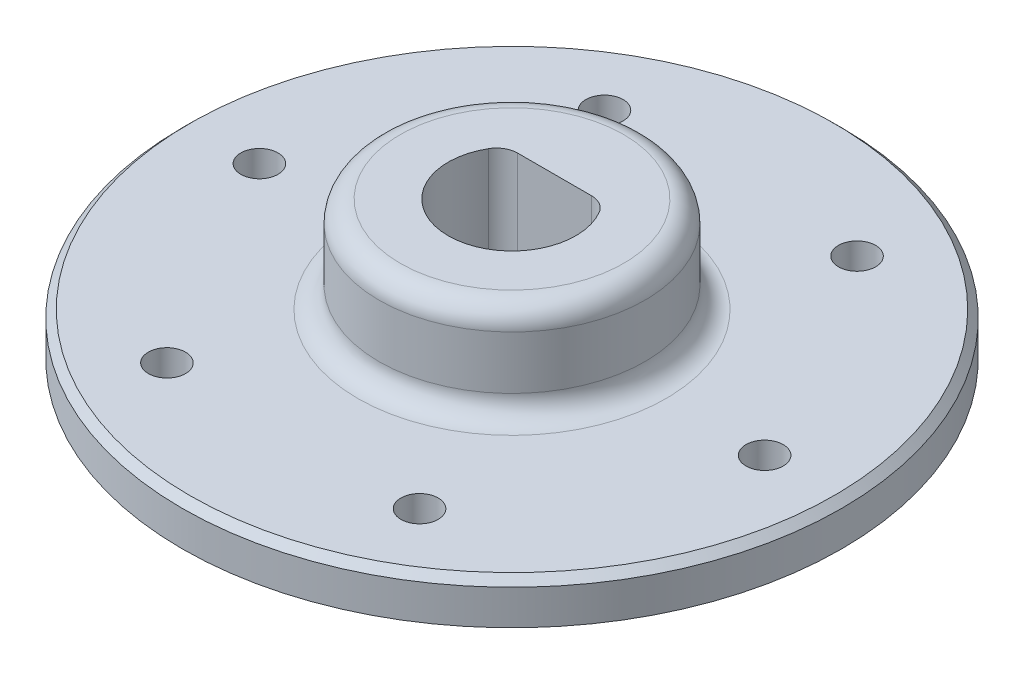
ISO-10303-21;
HEADER;
FILE_DESCRIPTION(('STEP AP214'),'2;1');
FILE_NAME('part.step','',(''),(''),'','','');
FILE_SCHEMA(('AUTOMOTIVE_DESIGN { 1 0 10303 214 1 1 1 1 }'));
ENDSEC;
DATA;
#1=APPLICATION_CONTEXT('core data for automotive mechanical design processes');
#2=APPLICATION_PROTOCOL_DEFINITION('international standard','automotive_design',2000,#1);
#3=PRODUCT_CONTEXT('',#1,'mechanical');
#4=PRODUCT('Part','Part','',(#3));
#5=PRODUCT_RELATED_PRODUCT_CATEGORY('part','',(#4));
#6=PRODUCT_DEFINITION_FORMATION('','',#4);
#7=PRODUCT_DEFINITION_CONTEXT('part definition',#1,'design');
#8=PRODUCT_DEFINITION('design','',#6,#7);
#9=PRODUCT_DEFINITION_SHAPE('','',#8);
#10=(LENGTH_UNIT() NAMED_UNIT(*) SI_UNIT(.MILLI.,.METRE.));
#11=(NAMED_UNIT(*) PLANE_ANGLE_UNIT() SI_UNIT($,.RADIAN.));
#12=(NAMED_UNIT(*) SI_UNIT($,.STERADIAN.) SOLID_ANGLE_UNIT());
#13=UNCERTAINTY_MEASURE_WITH_UNIT(LENGTH_MEASURE(1.E-05),#10,'distance_accuracy_value','');
#14=(GEOMETRIC_REPRESENTATION_CONTEXT(3) GLOBAL_UNCERTAINTY_ASSIGNED_CONTEXT((#13)) GLOBAL_UNIT_ASSIGNED_CONTEXT((#10,
#11,#12)) REPRESENTATION_CONTEXT('',''));
#15=CARTESIAN_POINT('',(0.,0.,0.));
#16=DIRECTION('',(0.,0.,1.));
#17=DIRECTION('',(1.,0.,0.));
#18=AXIS2_PLACEMENT_3D('',#15,#16,#17);
#19=CARTESIAN_POINT('',(0.,4.,0.));
#20=DIRECTION('',(0.,1.,0.));
#21=DIRECTION('',(0.,0.,1.));
#22=AXIS2_PLACEMENT_3D('',#19,#20,#21);
#23=PLANE('',#22);
#24=CARTESIAN_POINT('',(0.,4.,0.));
#25=DIRECTION('',(0.,1.,0.));
#26=DIRECTION('',(0.,0.,1.));
#27=AXIS2_PLACEMENT_3D('',#24,#25,#26);
#28=CIRCLE('',#27,30.3);
#29=CARTESIAN_POINT('',(0.,4.,30.3));
#30=VERTEX_POINT('',#29);
#31=EDGE_CURVE('E153',#30,#30,#28,.T.);
#32=ORIENTED_EDGE('',*,*,#31,.T.);
#33=EDGE_LOOP('',(#32));
#34=FACE_BOUND('',#33,.T.);
#35=CARTESIAN_POINT('',(0.,4.,0.));
#36=DIRECTION('',(0.,1.,0.));
#37=DIRECTION('',(0.,0.,1.));
#38=AXIS2_PLACEMENT_3D('',#35,#36,#37);
#39=CIRCLE('',#38,14.5);
#40=CARTESIAN_POINT('',(0.,4.,14.5));
#41=VERTEX_POINT('',#40);
#42=EDGE_CURVE('E147',#41,#41,#39,.F.);
#43=ORIENTED_EDGE('',*,*,#42,.T.);
#44=EDGE_LOOP('',(#43));
#45=FACE_BOUND('',#44,.T.);
#46=CARTESIAN_POINT('',(-11.8749999999977,4.,20.5681033398798));
#47=DIRECTION('',(0.,1.,0.));
#48=DIRECTION('',(0.,0.,1.));
#49=AXIS2_PLACEMENT_3D('',#46,#47,#48);
#50=CIRCLE('',#49,1.75);
#51=CARTESIAN_POINT('',(-11.8749999999977,4.,22.3181033398798));
#52=VERTEX_POINT('',#51);
#53=EDGE_CURVE('E109',#52,#52,#50,.T.);
#54=ORIENTED_EDGE('',*,*,#53,.F.);
#55=EDGE_LOOP('',(#54));
#56=FACE_BOUND('',#55,.T.);
#57=CARTESIAN_POINT('',(23.7500000000006,4.,-2.28723290307542E-12));
#58=DIRECTION('',(0.,1.,0.));
#59=DIRECTION('',(0.,0.,1.));
#60=AXIS2_PLACEMENT_3D('',#57,#58,#59);
#61=CIRCLE('',#60,1.75);
#62=CARTESIAN_POINT('',(23.7500000000006,4.,1.74999999999771));
#63=VERTEX_POINT('',#62);
#64=EDGE_CURVE('E121',#63,#63,#61,.T.);
#65=ORIENTED_EDGE('',*,*,#64,.F.);
#66=EDGE_LOOP('',(#65));
#67=FACE_BOUND('',#66,.T.);
#68=CARTESIAN_POINT('',(-11.875,4.,-20.5681033398804));
#69=DIRECTION('',(0.,1.,0.));
#70=DIRECTION('',(0.,0.,1.));
#71=AXIS2_PLACEMENT_3D('',#68,#69,#70);
#72=CIRCLE('',#71,1.75);
#73=CARTESIAN_POINT('',(-11.875,4.,-18.8181033398804));
#74=VERTEX_POINT('',#73);
#75=EDGE_CURVE('E133',#74,#74,#72,.T.);
#76=ORIENTED_EDGE('',*,*,#75,.F.);
#77=EDGE_LOOP('',(#76));
#78=FACE_BOUND('',#77,.T.);
#79=CARTESIAN_POINT('',(11.8749999999996,4.,-20.5681033398817));
#80=DIRECTION('',(0.,1.,0.));
#81=DIRECTION('',(0.,0.,1.));
#82=AXIS2_PLACEMENT_3D('',#79,#80,#81);
#83=CIRCLE('',#82,1.75);
#84=CARTESIAN_POINT('',(11.8749999999996,4.,-18.8181033398817));
#85=VERTEX_POINT('',#84);
#86=EDGE_CURVE('E127',#85,#85,#83,.T.);
#87=ORIENTED_EDGE('',*,*,#86,.F.);
#88=EDGE_LOOP('',(#87));
#89=FACE_BOUND('',#88,.T.);
#90=CARTESIAN_POINT('',(11.8750000000019,4.,20.5681033398785));
#91=DIRECTION('',(0.,1.,0.));
#92=DIRECTION('',(0.,0.,1.));
#93=AXIS2_PLACEMENT_3D('',#90,#91,#92);
#94=CIRCLE('',#93,1.75);
#95=CARTESIAN_POINT('',(11.8750000000019,4.,22.3181033398785));
#96=VERTEX_POINT('',#95);
#97=EDGE_CURVE('E115',#96,#96,#94,.T.);
#98=ORIENTED_EDGE('',*,*,#97,.F.);
#99=EDGE_LOOP('',(#98));
#100=FACE_BOUND('',#99,.T.);
#101=CARTESIAN_POINT('',(-23.7499999999987,4.,4.01588484688631E-13));
#102=DIRECTION('',(0.,1.,0.));
#103=DIRECTION('',(0.,0.,1.));
#104=AXIS2_PLACEMENT_3D('',#101,#102,#103);
#105=CIRCLE('',#104,1.75);
#106=CARTESIAN_POINT('',(-23.7499999999987,4.,1.7500000000004));
#107=VERTEX_POINT('',#106);
#108=EDGE_CURVE('E102',#107,#107,#105,.T.);
#109=ORIENTED_EDGE('',*,*,#108,.F.);
#110=EDGE_LOOP('',(#109));
#111=FACE_BOUND('',#110,.T.);
#112=ADVANCED_FACE('F33',(#34,#45,#56,#67,#78,#89,#100,#111),#23,.T.);
#113=CARTESIAN_POINT('',(0.,0.,0.));
#114=DIRECTION('',(0.,1.,0.));
#115=DIRECTION('',(0.,0.,1.));
#116=AXIS2_PLACEMENT_3D('',#113,#114,#115);
#117=PLANE('',#116);
#118=CARTESIAN_POINT('',(0.,0.,0.));
#119=DIRECTION('',(0.,1.,0.));
#120=DIRECTION('',(0.,0.,1.));
#121=AXIS2_PLACEMENT_3D('',#118,#119,#120);
#122=CIRCLE('',#121,11.5);
#123=CARTESIAN_POINT('',(0.,0.,11.5));
#124=VERTEX_POINT('',#123);
#125=EDGE_CURVE('E159',#124,#124,#122,.F.);
#126=ORIENTED_EDGE('',*,*,#125,.F.);
#127=EDGE_LOOP('',(#126));
#128=FACE_BOUND('',#127,.T.);
#129=CARTESIAN_POINT('',(0.,0.,0.));
#130=DIRECTION('',(0.,1.,0.));
#131=DIRECTION('',(0.,0.,1.));
#132=AXIS2_PLACEMENT_3D('',#129,#130,#131);
#133=CIRCLE('',#132,31.);
#134=CARTESIAN_POINT('',(0.,0.,31.));
#135=VERTEX_POINT('',#134);
#136=EDGE_CURVE('E136',#135,#135,#133,.T.);
#137=ORIENTED_EDGE('',*,*,#136,.F.);
#138=EDGE_LOOP('',(#137));
#139=FACE_BOUND('',#138,.T.);
#140=CARTESIAN_POINT('',(-11.875,0.,-20.5681033398804));
#141=DIRECTION('',(0.,1.,0.));
#142=DIRECTION('',(0.,0.,1.));
#143=AXIS2_PLACEMENT_3D('',#140,#141,#142);
#144=CIRCLE('',#143,1.75);
#145=CARTESIAN_POINT('',(-11.875,0.,-18.8181033398804));
#146=VERTEX_POINT('',#145);
#147=EDGE_CURVE('E130',#146,#146,#144,.T.);
#148=ORIENTED_EDGE('',*,*,#147,.T.);
#149=EDGE_LOOP('',(#148));
#150=FACE_BOUND('',#149,.T.);
#151=CARTESIAN_POINT('',(11.8749999999996,0.,-20.5681033398817));
#152=DIRECTION('',(0.,1.,0.));
#153=DIRECTION('',(0.,0.,1.));
#154=AXIS2_PLACEMENT_3D('',#151,#152,#153);
#155=CIRCLE('',#154,1.75);
#156=CARTESIAN_POINT('',(11.8749999999996,0.,-18.8181033398817));
#157=VERTEX_POINT('',#156);
#158=EDGE_CURVE('E124',#157,#157,#155,.T.);
#159=ORIENTED_EDGE('',*,*,#158,.T.);
#160=EDGE_LOOP('',(#159));
#161=FACE_BOUND('',#160,.T.);
#162=CARTESIAN_POINT('',(23.7500000000006,0.,-2.28723290307542E-12));
#163=DIRECTION('',(0.,1.,0.));
#164=DIRECTION('',(0.,0.,1.));
#165=AXIS2_PLACEMENT_3D('',#162,#163,#164);
#166=CIRCLE('',#165,1.75);
#167=CARTESIAN_POINT('',(23.7500000000006,0.,1.74999999999771));
#168=VERTEX_POINT('',#167);
#169=EDGE_CURVE('E118',#168,#168,#166,.T.);
#170=ORIENTED_EDGE('',*,*,#169,.T.);
#171=EDGE_LOOP('',(#170));
#172=FACE_BOUND('',#171,.T.);
#173=CARTESIAN_POINT('',(11.8750000000019,0.,20.5681033398785));
#174=DIRECTION('',(0.,1.,0.));
#175=DIRECTION('',(0.,0.,1.));
#176=AXIS2_PLACEMENT_3D('',#173,#174,#175);
#177=CIRCLE('',#176,1.75);
#178=CARTESIAN_POINT('',(11.8750000000019,0.,22.3181033398785));
#179=VERTEX_POINT('',#178);
#180=EDGE_CURVE('E112',#179,#179,#177,.T.);
#181=ORIENTED_EDGE('',*,*,#180,.T.);
#182=EDGE_LOOP('',(#181));
#183=FACE_BOUND('',#182,.T.);
#184=CARTESIAN_POINT('',(-11.8749999999977,0.,20.5681033398798));
#185=DIRECTION('',(0.,1.,0.));
#186=DIRECTION('',(0.,0.,1.));
#187=AXIS2_PLACEMENT_3D('',#184,#185,#186);
#188=CIRCLE('',#187,1.75);
#189=CARTESIAN_POINT('',(-11.8749999999977,0.,22.3181033398798));
#190=VERTEX_POINT('',#189);
#191=EDGE_CURVE('E105',#190,#190,#188,.T.);
#192=ORIENTED_EDGE('',*,*,#191,.T.);
#193=EDGE_LOOP('',(#192));
#194=FACE_BOUND('',#193,.T.);
#195=CARTESIAN_POINT('',(-23.7499999999987,0.,4.01588484688631E-13));
#196=DIRECTION('',(0.,1.,0.));
#197=DIRECTION('',(0.,0.,1.));
#198=AXIS2_PLACEMENT_3D('',#195,#196,#197);
#199=CIRCLE('',#198,1.75);
#200=CARTESIAN_POINT('',(-23.7499999999987,0.,1.7500000000004));
#201=VERTEX_POINT('',#200);
#202=EDGE_CURVE('E106',#201,#201,#199,.T.);
#203=ORIENTED_EDGE('',*,*,#202,.T.);
#204=EDGE_LOOP('',(#203));
#205=FACE_BOUND('',#204,.T.);
#206=ADVANCED_FACE('F182',(#128,#139,#150,#161,#172,#183,#194,#205),#117,.F.);
#207=CARTESIAN_POINT('',(0.,4.,0.));
#208=DIRECTION('',(0.,-1.,0.));
#209=DIRECTION('',(0.,0.,-1.));
#210=AXIS2_PLACEMENT_3D('',#207,#208,#209);
#211=CYLINDRICAL_SURFACE('',#210,31.);
#212=CARTESIAN_POINT('',(0.,3.29999999999998,0.));
#213=DIRECTION('',(0.,1.,0.));
#214=DIRECTION('',(0.,0.,1.));
#215=AXIS2_PLACEMENT_3D('',#212,#213,#214);
#216=CIRCLE('',#215,31.);
#217=CARTESIAN_POINT('',(0.,3.29999999999998,31.));
#218=VERTEX_POINT('',#217);
#219=EDGE_CURVE('E156',#218,#218,#216,.F.);
#220=ORIENTED_EDGE('',*,*,#219,.T.);
#221=EDGE_LOOP('',(#220));
#222=FACE_BOUND('',#221,.T.);
#223=ORIENTED_EDGE('',*,*,#136,.T.);
#224=EDGE_LOOP('',(#223));
#225=FACE_BOUND('',#224,.T.);
#226=ADVANCED_FACE('F188',(#222,#225),#211,.T.);
#227=CARTESIAN_POINT('',(-11.875,4.,-20.5681033398804));
#228=DIRECTION('',(0.,-1.,0.));
#229=DIRECTION('',(0.,0.,-1.));
#230=AXIS2_PLACEMENT_3D('',#227,#228,#229);
#231=CYLINDRICAL_SURFACE('',#230,1.75);
#232=ORIENTED_EDGE('',*,*,#75,.T.);
#233=EDGE_LOOP('',(#232));
#234=FACE_BOUND('',#233,.T.);
#235=ORIENTED_EDGE('',*,*,#147,.F.);
#236=EDGE_LOOP('',(#235));
#237=FACE_BOUND('',#236,.T.);
#238=ADVANCED_FACE('F193',(#234,#237),#231,.F.);
#239=CARTESIAN_POINT('',(11.8749999999996,4.,-20.5681033398817));
#240=DIRECTION('',(0.,-1.,0.));
#241=DIRECTION('',(0.,0.,-1.));
#242=AXIS2_PLACEMENT_3D('',#239,#240,#241);
#243=CYLINDRICAL_SURFACE('',#242,1.75);
#244=ORIENTED_EDGE('',*,*,#86,.T.);
#245=EDGE_LOOP('',(#244));
#246=FACE_BOUND('',#245,.T.);
#247=ORIENTED_EDGE('',*,*,#158,.F.);
#248=EDGE_LOOP('',(#247));
#249=FACE_BOUND('',#248,.T.);
#250=ADVANCED_FACE('F266',(#246,#249),#243,.F.);
#251=CARTESIAN_POINT('',(23.7500000000006,4.,-2.28723290307542E-12));
#252=DIRECTION('',(0.,-1.,0.));
#253=DIRECTION('',(0.,0.,-1.));
#254=AXIS2_PLACEMENT_3D('',#251,#252,#253);
#255=CYLINDRICAL_SURFACE('',#254,1.75);
#256=ORIENTED_EDGE('',*,*,#64,.T.);
#257=EDGE_LOOP('',(#256));
#258=FACE_BOUND('',#257,.T.);
#259=ORIENTED_EDGE('',*,*,#169,.F.);
#260=EDGE_LOOP('',(#259));
#261=FACE_BOUND('',#260,.T.);
#262=ADVANCED_FACE('F263',(#258,#261),#255,.F.);
#263=CARTESIAN_POINT('',(11.8750000000019,4.,20.5681033398785));
#264=DIRECTION('',(0.,-1.,0.));
#265=DIRECTION('',(0.,0.,-1.));
#266=AXIS2_PLACEMENT_3D('',#263,#264,#265);
#267=CYLINDRICAL_SURFACE('',#266,1.75);
#268=ORIENTED_EDGE('',*,*,#97,.T.);
#269=EDGE_LOOP('',(#268));
#270=FACE_BOUND('',#269,.T.);
#271=ORIENTED_EDGE('',*,*,#180,.F.);
#272=EDGE_LOOP('',(#271));
#273=FACE_BOUND('',#272,.T.);
#274=ADVANCED_FACE('F256',(#270,#273),#267,.F.);
#275=CARTESIAN_POINT('',(-11.8749999999977,4.,20.5681033398798));
#276=DIRECTION('',(0.,-1.,0.));
#277=DIRECTION('',(0.,0.,-1.));
#278=AXIS2_PLACEMENT_3D('',#275,#276,#277);
#279=CYLINDRICAL_SURFACE('',#278,1.75);
#280=ORIENTED_EDGE('',*,*,#53,.T.);
#281=EDGE_LOOP('',(#280));
#282=FACE_BOUND('',#281,.T.);
#283=ORIENTED_EDGE('',*,*,#191,.F.);
#284=EDGE_LOOP('',(#283));
#285=FACE_BOUND('',#284,.T.);
#286=ADVANCED_FACE('F247',(#282,#285),#279,.F.);
#287=CARTESIAN_POINT('',(-23.7499999999987,4.,4.01588484688631E-13));
#288=DIRECTION('',(0.,-1.,0.));
#289=DIRECTION('',(0.,0.,-1.));
#290=AXIS2_PLACEMENT_3D('',#287,#288,#289);
#291=CYLINDRICAL_SURFACE('',#290,1.75);
#292=ORIENTED_EDGE('',*,*,#108,.T.);
#293=EDGE_LOOP('',(#292));
#294=FACE_BOUND('',#293,.T.);
#295=ORIENTED_EDGE('',*,*,#202,.F.);
#296=EDGE_LOOP('',(#295));
#297=FACE_BOUND('',#296,.T.);
#298=ADVANCED_FACE('F244',(#294,#297),#291,.F.);
#299=CARTESIAN_POINT('',(0.,13.,0.));
#300=DIRECTION('',(0.,-1.,0.));
#301=DIRECTION('',(0.,0.,-1.));
#302=AXIS2_PLACEMENT_3D('',#299,#300,#301);
#303=CYLINDRICAL_SURFACE('',#302,12.5);
#304=CARTESIAN_POINT('',(0.,6.,0.));
#305=DIRECTION('',(0.,1.,0.));
#306=DIRECTION('',(0.,0.,1.));
#307=AXIS2_PLACEMENT_3D('',#304,#305,#306);
#308=CIRCLE('',#307,12.5);
#309=CARTESIAN_POINT('',(0.,6.,12.5));
#310=VERTEX_POINT('',#309);
#311=EDGE_CURVE('E144',#310,#310,#308,.T.);
#312=ORIENTED_EDGE('',*,*,#311,.T.);
#313=EDGE_LOOP('',(#312));
#314=FACE_BOUND('',#313,.T.);
#315=CARTESIAN_POINT('',(0.,11.,0.));
#316=DIRECTION('',(0.,1.,0.));
#317=DIRECTION('',(0.,0.,1.));
#318=AXIS2_PLACEMENT_3D('',#315,#316,#317);
#319=CIRCLE('',#318,12.5);
#320=CARTESIAN_POINT('',(0.,11.,12.5));
#321=VERTEX_POINT('',#320);
#322=EDGE_CURVE('E141',#321,#321,#319,.F.);
#323=ORIENTED_EDGE('',*,*,#322,.T.);
#324=EDGE_LOOP('',(#323));
#325=FACE_BOUND('',#324,.T.);
#326=ADVANCED_FACE('F246',(#314,#325),#303,.T.);
#327=CARTESIAN_POINT('',(0.,13.,0.));
#328=DIRECTION('',(0.,1.,0.));
#329=DIRECTION('',(0.,0.,1.));
#330=AXIS2_PLACEMENT_3D('',#327,#328,#329);
#331=PLANE('',#330);
#332=DIRECTION('',(1.,0.,0.));
#333=VECTOR('',#332,1.);
#334=CARTESIAN_POINT('',(-4.47213595499958,13.,-4.));
#335=LINE('',#334,#333);
#336=CARTESIAN_POINT('',(-3.46410161513775,13.,-4.));
#337=VERTEX_POINT('',#336);
#338=CARTESIAN_POINT('',(3.46410161513775,13.,-4.));
#339=VERTEX_POINT('',#338);
#340=EDGE_CURVE('E99',#337,#339,#335,.T.);
#341=ORIENTED_EDGE('',*,*,#340,.T.);
#342=CARTESIAN_POINT('',(3.46410161513775,13.,-2.));
#343=DIRECTION('',(0.,1.,0.));
#344=DIRECTION('',(0.,0.,1.));
#345=AXIS2_PLACEMENT_3D('',#342,#343,#344);
#346=CIRCLE('',#345,2.);
#347=CARTESIAN_POINT('',(5.19615242270663,13.,-3.));
#348=VERTEX_POINT('',#347);
#349=EDGE_CURVE('E81',#339,#348,#346,.F.);
#350=ORIENTED_EDGE('',*,*,#349,.T.);
#351=CARTESIAN_POINT('',(0.,13.,0.));
#352=DIRECTION('',(0.,-1.,0.));
#353=DIRECTION('',(0.,0.,-1.));
#354=AXIS2_PLACEMENT_3D('',#351,#352,#353);
#355=CIRCLE('',#354,6.);
#356=CARTESIAN_POINT('',(-5.19615242270663,13.,-3.));
#357=VERTEX_POINT('',#356);
#358=EDGE_CURVE('E89',#348,#357,#355,.T.);
#359=ORIENTED_EDGE('',*,*,#358,.T.);
#360=CARTESIAN_POINT('',(-3.46410161513775,13.,-2.));
#361=DIRECTION('',(0.,1.,0.));
#362=DIRECTION('',(0.,0.,1.));
#363=AXIS2_PLACEMENT_3D('',#360,#361,#362);
#364=CIRCLE('',#363,2.);
#365=EDGE_CURVE('E11',#357,#337,#364,.F.);
#366=ORIENTED_EDGE('',*,*,#365,.T.);
#367=EDGE_LOOP('',(#341,#350,#359,#366));
#368=FACE_BOUND('',#367,.T.);
#369=CARTESIAN_POINT('',(0.,13.,0.));
#370=DIRECTION('',(0.,1.,0.));
#371=DIRECTION('',(0.,0.,1.));
#372=AXIS2_PLACEMENT_3D('',#369,#370,#371);
#373=CIRCLE('',#372,10.5);
#374=CARTESIAN_POINT('',(0.,13.,10.5));
#375=VERTEX_POINT('',#374);
#376=EDGE_CURVE('E150',#375,#375,#373,.T.);
#377=ORIENTED_EDGE('',*,*,#376,.T.);
#378=EDGE_LOOP('',(#377));
#379=FACE_BOUND('',#378,.T.);
#380=ADVANCED_FACE('F172',(#368,#379),#331,.T.);
#381=CARTESIAN_POINT('',(0.,6.,0.));
#382=DIRECTION('',(0.,1.,0.));
#383=DIRECTION('',(0.,0.,1.));
#384=AXIS2_PLACEMENT_3D('',#381,#382,#383);
#385=TOROIDAL_SURFACE('',#384,14.5,2.);
#386=ORIENTED_EDGE('',*,*,#42,.F.);
#387=EDGE_LOOP('',(#386));
#388=FACE_BOUND('',#387,.T.);
#389=ORIENTED_EDGE('',*,*,#311,.F.);
#390=EDGE_LOOP('',(#389));
#391=FACE_BOUND('',#390,.T.);
#392=ADVANCED_FACE('F199',(#388,#391),#385,.F.);
#393=CARTESIAN_POINT('',(0.,11.,0.));
#394=DIRECTION('',(0.,1.,0.));
#395=DIRECTION('',(0.,0.,1.));
#396=AXIS2_PLACEMENT_3D('',#393,#394,#395);
#397=TOROIDAL_SURFACE('',#396,10.5,2.);
#398=ORIENTED_EDGE('',*,*,#322,.F.);
#399=EDGE_LOOP('',(#398));
#400=FACE_BOUND('',#399,.T.);
#401=ORIENTED_EDGE('',*,*,#376,.F.);
#402=EDGE_LOOP('',(#401));
#403=FACE_BOUND('',#402,.T.);
#404=ADVANCED_FACE('F202',(#400,#403),#397,.T.);
#405=CARTESIAN_POINT('',(0.,4.,0.));
#406=DIRECTION('',(0.,-1.,0.));
#407=DIRECTION('',(0.,0.,-1.));
#408=AXIS2_PLACEMENT_3D('',#405,#406,#407);
#409=CONICAL_SURFACE('',#408,30.3,0.785398163397441);
#410=ORIENTED_EDGE('',*,*,#219,.F.);
#411=EDGE_LOOP('',(#410));
#412=FACE_BOUND('',#411,.T.);
#413=ORIENTED_EDGE('',*,*,#31,.F.);
#414=EDGE_LOOP('',(#413));
#415=FACE_BOUND('',#414,.T.);
#416=ADVANCED_FACE('F206',(#412,#415),#409,.T.);
#417=CARTESIAN_POINT('',(0.,-9.,0.));
#418=DIRECTION('',(0.,1.,0.));
#419=DIRECTION('',(0.,0.,1.));
#420=AXIS2_PLACEMENT_3D('',#417,#418,#419);
#421=CYLINDRICAL_SURFACE('',#420,11.5);
#422=CARTESIAN_POINT('',(0.,-7.,0.));
#423=DIRECTION('',(0.,-1.,0.));
#424=DIRECTION('',(0.,0.,-1.));
#425=AXIS2_PLACEMENT_3D('',#422,#423,#424);
#426=CIRCLE('',#425,11.5);
#427=CARTESIAN_POINT('',(0.,-7.,-11.5));
#428=VERTEX_POINT('',#427);
#429=EDGE_CURVE('E165',#428,#428,#426,.F.);
#430=ORIENTED_EDGE('',*,*,#429,.T.);
#431=EDGE_LOOP('',(#430));
#432=FACE_BOUND('',#431,.T.);
#433=ORIENTED_EDGE('',*,*,#125,.T.);
#434=EDGE_LOOP('',(#433));
#435=FACE_BOUND('',#434,.T.);
#436=ADVANCED_FACE('F210',(#432,#435),#421,.T.);
#437=CARTESIAN_POINT('',(0.,-9.,0.));
#438=DIRECTION('',(0.,-1.,0.));
#439=DIRECTION('',(0.,0.,-1.));
#440=AXIS2_PLACEMENT_3D('',#437,#438,#439);
#441=PLANE('',#440);
#442=CARTESIAN_POINT('',(0.,-9.,0.));
#443=DIRECTION('',(0.,-1.,0.));
#444=DIRECTION('',(0.,0.,-1.));
#445=AXIS2_PLACEMENT_3D('',#442,#443,#444);
#446=CIRCLE('',#445,6.);
#447=CARTESIAN_POINT('',(5.19615242270663,-9.,-3.));
#448=VERTEX_POINT('',#447);
#449=CARTESIAN_POINT('',(-5.19615242270663,-9.,-3.));
#450=VERTEX_POINT('',#449);
#451=EDGE_CURVE('E87',#448,#450,#446,.T.);
#452=ORIENTED_EDGE('',*,*,#451,.F.);
#453=CARTESIAN_POINT('',(3.46410161513775,-9.,-2.));
#454=DIRECTION('',(0.,-1.,0.));
#455=DIRECTION('',(0.,0.,-1.));
#456=AXIS2_PLACEMENT_3D('',#453,#454,#455);
#457=CIRCLE('',#456,2.);
#458=CARTESIAN_POINT('',(3.46410161513775,-9.,-4.));
#459=VERTEX_POINT('',#458);
#460=EDGE_CURVE('E73',#448,#459,#457,.F.);
#461=ORIENTED_EDGE('',*,*,#460,.T.);
#462=DIRECTION('',(1.,0.,0.));
#463=VECTOR('',#462,1.);
#464=CARTESIAN_POINT('',(-4.47213595499958,-9.,-4.));
#465=LINE('',#464,#463);
#466=CARTESIAN_POINT('',(-3.46410161513775,-9.,-4.));
#467=VERTEX_POINT('',#466);
#468=EDGE_CURVE('E95',#467,#459,#465,.T.);
#469=ORIENTED_EDGE('',*,*,#468,.F.);
#470=CARTESIAN_POINT('',(-3.46410161513775,-9.,-2.));
#471=DIRECTION('',(0.,-1.,0.));
#472=DIRECTION('',(0.,0.,-1.));
#473=AXIS2_PLACEMENT_3D('',#470,#471,#472);
#474=CIRCLE('',#473,2.);
#475=EDGE_CURVE('E41',#467,#450,#474,.F.);
#476=ORIENTED_EDGE('',*,*,#475,.T.);
#477=EDGE_LOOP('',(#452,#461,#469,#476));
#478=FACE_BOUND('',#477,.T.);
#479=CARTESIAN_POINT('',(0.,-9.,0.));
#480=DIRECTION('',(0.,-1.,0.));
#481=DIRECTION('',(0.,0.,-1.));
#482=AXIS2_PLACEMENT_3D('',#479,#480,#481);
#483=CIRCLE('',#482,9.5);
#484=CARTESIAN_POINT('',(0.,-9.,-9.5));
#485=VERTEX_POINT('',#484);
#486=EDGE_CURVE('E162',#485,#485,#483,.T.);
#487=ORIENTED_EDGE('',*,*,#486,.T.);
#488=EDGE_LOOP('',(#487));
#489=FACE_BOUND('',#488,.T.);
#490=ADVANCED_FACE('F93',(#478,#489),#441,.T.);
#491=CARTESIAN_POINT('',(0.,-7.,0.));
#492=DIRECTION('',(0.,-1.,0.));
#493=DIRECTION('',(0.,0.,-1.));
#494=AXIS2_PLACEMENT_3D('',#491,#492,#493);
#495=TOROIDAL_SURFACE('',#494,9.5,2.);
#496=ORIENTED_EDGE('',*,*,#429,.F.);
#497=EDGE_LOOP('',(#496));
#498=FACE_BOUND('',#497,.T.);
#499=ORIENTED_EDGE('',*,*,#486,.F.);
#500=EDGE_LOOP('',(#499));
#501=FACE_BOUND('',#500,.T.);
#502=ADVANCED_FACE('F212',(#498,#501),#495,.T.);
#503=CARTESIAN_POINT('',(0.,13.,0.));
#504=DIRECTION('',(0.,-1.,0.));
#505=DIRECTION('',(0.,0.,-1.));
#506=AXIS2_PLACEMENT_3D('',#503,#504,#505);
#507=CYLINDRICAL_SURFACE('',#506,6.);
#508=ORIENTED_EDGE('',*,*,#358,.F.);
#509=DIRECTION('',(0.,-1.,0.));
#510=VECTOR('',#509,1.);
#511=CARTESIAN_POINT('',(5.19615242270663,13.,-3.));
#512=LINE('',#511,#510);
#513=EDGE_CURVE('E77',#348,#448,#512,.T.);
#514=ORIENTED_EDGE('',*,*,#513,.T.);
#515=ORIENTED_EDGE('',*,*,#451,.T.);
#516=DIRECTION('',(0.,-1.,0.));
#517=VECTOR('',#516,1.);
#518=CARTESIAN_POINT('',(-5.19615242270663,13.,-3.));
#519=LINE('',#518,#517);
#520=EDGE_CURVE('E91',#450,#357,#519,.F.);
#521=ORIENTED_EDGE('',*,*,#520,.T.);
#522=EDGE_LOOP('',(#508,#514,#515,#521));
#523=FACE_BOUND('',#522,.T.);
#524=ADVANCED_FACE('F86',(#523),#507,.F.);
#525=CARTESIAN_POINT('',(-4.47213595499958,13.,-4.));
#526=DIRECTION('',(0.,0.,-1.));
#527=DIRECTION('',(-1.,0.,0.));
#528=AXIS2_PLACEMENT_3D('',#525,#526,#527);
#529=PLANE('',#528);
#530=ORIENTED_EDGE('',*,*,#468,.T.);
#531=DIRECTION('',(0.,1.,0.));
#532=VECTOR('',#531,1.);
#533=CARTESIAN_POINT('',(3.46410161513775,13.,-4.));
#534=LINE('',#533,#532);
#535=EDGE_CURVE('E48',#459,#339,#534,.T.);
#536=ORIENTED_EDGE('',*,*,#535,.T.);
#537=ORIENTED_EDGE('',*,*,#340,.F.);
#538=DIRECTION('',(0.,1.,0.));
#539=VECTOR('',#538,1.);
#540=CARTESIAN_POINT('',(-3.46410161513775,-9.,-4.));
#541=LINE('',#540,#539);
#542=EDGE_CURVE('E90',#337,#467,#541,.F.);
#543=ORIENTED_EDGE('',*,*,#542,.T.);
#544=EDGE_LOOP('',(#530,#536,#537,#543));
#545=FACE_BOUND('',#544,.T.);
#546=ADVANCED_FACE('F175',(#545),#529,.F.);
#547=CARTESIAN_POINT('',(3.46410161513775,13.,-2.));
#548=DIRECTION('',(0.,-1.,0.));
#549=DIRECTION('',(0.,0.,-1.));
#550=AXIS2_PLACEMENT_3D('',#547,#548,#549);
#551=CYLINDRICAL_SURFACE('',#550,2.);
#552=ORIENTED_EDGE('',*,*,#349,.F.);
#553=ORIENTED_EDGE('',*,*,#535,.F.);
#554=ORIENTED_EDGE('',*,*,#460,.F.);
#555=ORIENTED_EDGE('',*,*,#513,.F.);
#556=EDGE_LOOP('',(#552,#553,#554,#555));
#557=FACE_BOUND('',#556,.T.);
#558=ADVANCED_FACE('F76',(#557),#551,.F.);
#559=CARTESIAN_POINT('',(-3.46410161513775,13.,-2.));
#560=DIRECTION('',(0.,-1.,0.));
#561=DIRECTION('',(0.,0.,-1.));
#562=AXIS2_PLACEMENT_3D('',#559,#560,#561);
#563=CYLINDRICAL_SURFACE('',#562,2.);
#564=ORIENTED_EDGE('',*,*,#365,.F.);
#565=ORIENTED_EDGE('',*,*,#520,.F.);
#566=ORIENTED_EDGE('',*,*,#475,.F.);
#567=ORIENTED_EDGE('',*,*,#542,.F.);
#568=EDGE_LOOP('',(#564,#565,#566,#567));
#569=FACE_BOUND('',#568,.T.);
#570=ADVANCED_FACE('F35',(#569),#563,.F.);
#571=CLOSED_SHELL('',(#112,#206,#226,#238,#250,#262,#274,#286,#298,#326,#380,#392,#404,#416,
#436,#490,#502,#524,#546,#558,#570));
#572=MANIFOLD_SOLID_BREP('B2',#571);
#573=ADVANCED_BREP_SHAPE_REPRESENTATION('',(#18,#572),#14);
#574=SHAPE_DEFINITION_REPRESENTATION(#9,#573);
ENDSEC;
END-ISO-10303-21;
